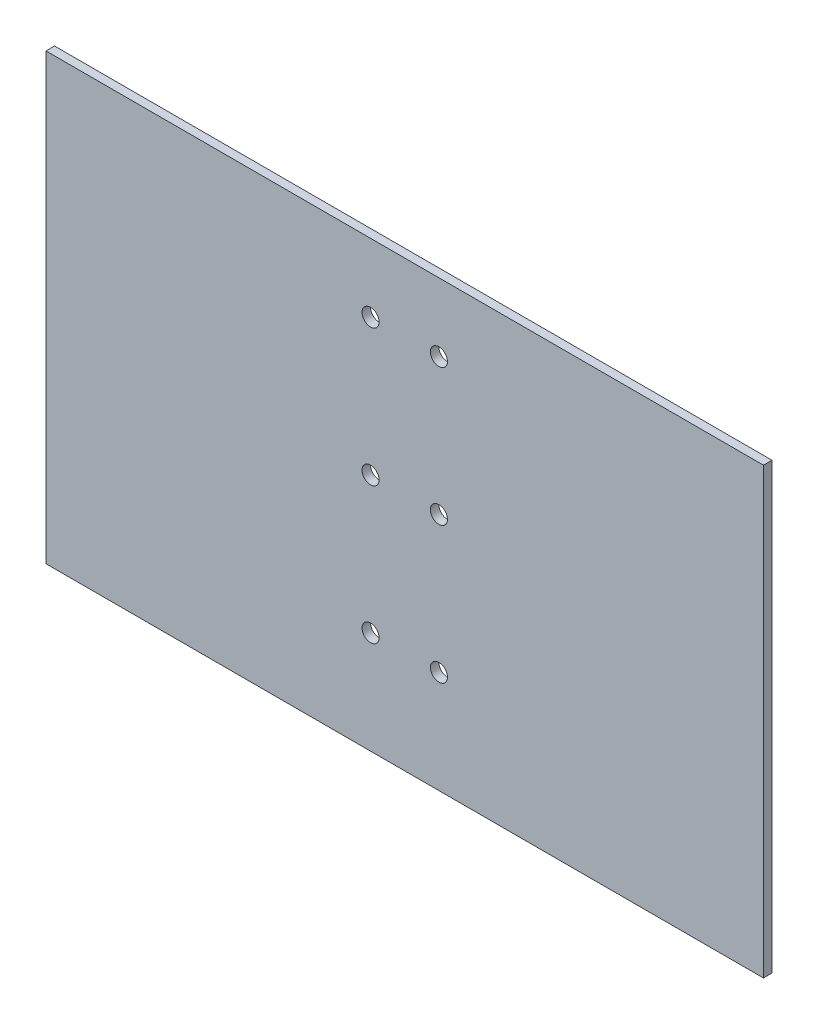
ISO-10303-21;
HEADER;
FILE_DESCRIPTION(('STEP AP214'),'2;1');
FILE_NAME('part.step','',(''),(''),'','','');
FILE_SCHEMA(('AUTOMOTIVE_DESIGN { 1 0 10303 214 1 1 1 1 }'));
ENDSEC;
DATA;
#1=APPLICATION_CONTEXT('core data for automotive mechanical design processes');
#2=APPLICATION_PROTOCOL_DEFINITION('international standard','automotive_design',2000,#1);
#3=PRODUCT_CONTEXT('',#1,'mechanical');
#4=PRODUCT('Part','Part','',(#3));
#5=PRODUCT_RELATED_PRODUCT_CATEGORY('part','',(#4));
#6=PRODUCT_DEFINITION_FORMATION('','',#4);
#7=PRODUCT_DEFINITION_CONTEXT('part definition',#1,'design');
#8=PRODUCT_DEFINITION('design','',#6,#7);
#9=PRODUCT_DEFINITION_SHAPE('','',#8);
#10=(LENGTH_UNIT() NAMED_UNIT(*) SI_UNIT(.MILLI.,.METRE.));
#11=(NAMED_UNIT(*) PLANE_ANGLE_UNIT() SI_UNIT($,.RADIAN.));
#12=(NAMED_UNIT(*) SI_UNIT($,.STERADIAN.) SOLID_ANGLE_UNIT());
#13=UNCERTAINTY_MEASURE_WITH_UNIT(LENGTH_MEASURE(1.E-05),#10,'distance_accuracy_value','');
#14=(GEOMETRIC_REPRESENTATION_CONTEXT(3) GLOBAL_UNCERTAINTY_ASSIGNED_CONTEXT((#13)) GLOBAL_UNIT_ASSIGNED_CONTEXT((#10,
#11,#12)) REPRESENTATION_CONTEXT('',''));
#15=CARTESIAN_POINT('',(0.,0.,0.));
#16=DIRECTION('',(0.,0.,1.));
#17=DIRECTION('',(1.,0.,0.));
#18=AXIS2_PLACEMENT_3D('',#15,#16,#17);
#19=CARTESIAN_POINT('',(0.,0.,6.35));
#20=DIRECTION('',(0.,0.,-1.));
#21=DIRECTION('',(-1.,0.,0.));
#22=AXIS2_PLACEMENT_3D('',#19,#20,#21);
#23=PLANE('',#22);
#24=CARTESIAN_POINT('',(-25.3999999999992,-76.2,6.35));
#25=DIRECTION('',(0.,0.,1.));
#26=DIRECTION('',(1.,0.,0.));
#27=AXIS2_PLACEMENT_3D('',#24,#25,#26);
#28=CIRCLE('',#27,6.35);
#29=CARTESIAN_POINT('',(-19.0499999999992,-76.2,6.35));
#30=VERTEX_POINT('',#29);
#31=EDGE_CURVE('E143',#30,#30,#28,.T.);
#32=ORIENTED_EDGE('',*,*,#31,.F.);
#33=EDGE_LOOP('',(#32));
#34=FACE_BOUND('',#33,.T.);
#35=CARTESIAN_POINT('',(-25.4,25.4,6.35));
#36=DIRECTION('',(0.,0.,1.));
#37=DIRECTION('',(1.,0.,0.));
#38=AXIS2_PLACEMENT_3D('',#35,#36,#37);
#39=CIRCLE('',#38,6.35);
#40=CARTESIAN_POINT('',(-19.05,25.4,6.35));
#41=VERTEX_POINT('',#40);
#42=EDGE_CURVE('E151',#41,#41,#39,.T.);
#43=ORIENTED_EDGE('',*,*,#42,.F.);
#44=EDGE_LOOP('',(#43));
#45=FACE_BOUND('',#44,.T.);
#46=CARTESIAN_POINT('',(25.4,25.4,6.35));
#47=DIRECTION('',(0.,0.,1.));
#48=DIRECTION('',(-1.,0.,0.));
#49=AXIS2_PLACEMENT_3D('',#46,#47,#48);
#50=CIRCLE('',#49,6.35000000000001);
#51=CARTESIAN_POINT('',(19.05,25.4,6.35));
#52=VERTEX_POINT('',#51);
#53=EDGE_CURVE('E159',#52,#52,#50,.T.);
#54=ORIENTED_EDGE('',*,*,#53,.F.);
#55=EDGE_LOOP('',(#54));
#56=FACE_BOUND('',#55,.T.);
#57=CARTESIAN_POINT('',(25.4,127.,6.35));
#58=DIRECTION('',(0.,0.,1.));
#59=DIRECTION('',(-1.,0.,0.));
#60=AXIS2_PLACEMENT_3D('',#57,#58,#59);
#61=CIRCLE('',#60,6.35);
#62=CARTESIAN_POINT('',(19.05,127.,6.35));
#63=VERTEX_POINT('',#62);
#64=EDGE_CURVE('E135',#63,#63,#61,.T.);
#65=ORIENTED_EDGE('',*,*,#64,.F.);
#66=EDGE_LOOP('',(#65));
#67=FACE_BOUND('',#66,.T.);
#68=CARTESIAN_POINT('',(25.3999999999993,-76.2,6.35));
#69=DIRECTION('',(0.,0.,1.));
#70=DIRECTION('',(-1.,0.,0.));
#71=AXIS2_PLACEMENT_3D('',#68,#69,#70);
#72=CIRCLE('',#71,6.35);
#73=CARTESIAN_POINT('',(19.0499999999993,-76.2,6.35));
#74=VERTEX_POINT('',#73);
#75=EDGE_CURVE('E126',#74,#74,#72,.T.);
#76=ORIENTED_EDGE('',*,*,#75,.F.);
#77=EDGE_LOOP('',(#76));
#78=FACE_BOUND('',#77,.T.);
#79=CARTESIAN_POINT('',(-25.4,127.,6.35));
#80=DIRECTION('',(0.,0.,1.));
#81=DIRECTION('',(1.,0.,0.));
#82=AXIS2_PLACEMENT_3D('',#79,#80,#81);
#83=CIRCLE('',#82,6.35);
#84=CARTESIAN_POINT('',(-19.05,127.,6.35));
#85=VERTEX_POINT('',#84);
#86=EDGE_CURVE('E43',#85,#85,#83,.T.);
#87=ORIENTED_EDGE('',*,*,#86,.F.);
#88=EDGE_LOOP('',(#87));
#89=FACE_BOUND('',#88,.T.);
#90=DIRECTION('',(0.,-1.,0.));
#91=VECTOR('',#90,1.);
#92=CARTESIAN_POINT('',(-266.7,-152.4,6.35));
#93=LINE('',#92,#91);
#94=CARTESIAN_POINT('',(-266.7,177.8,6.35));
#95=VERTEX_POINT('',#94);
#96=CARTESIAN_POINT('',(-266.7,-152.4,6.35));
#97=VERTEX_POINT('',#96);
#98=EDGE_CURVE('E112',#95,#97,#93,.T.);
#99=ORIENTED_EDGE('',*,*,#98,.T.);
#100=DIRECTION('',(1.,0.,0.));
#101=VECTOR('',#100,1.);
#102=CARTESIAN_POINT('',(-266.7,-152.4,6.35));
#103=LINE('',#102,#101);
#104=CARTESIAN_POINT('',(266.7,-152.4,6.35));
#105=VERTEX_POINT('',#104);
#106=EDGE_CURVE('E116',#97,#105,#103,.T.);
#107=ORIENTED_EDGE('',*,*,#106,.T.);
#108=DIRECTION('',(0.,1.,0.));
#109=VECTOR('',#108,1.);
#110=CARTESIAN_POINT('',(266.7,-152.4,6.35));
#111=LINE('',#110,#109);
#112=CARTESIAN_POINT('',(266.7,177.8,6.35));
#113=VERTEX_POINT('',#112);
#114=EDGE_CURVE('E93',#105,#113,#111,.T.);
#115=ORIENTED_EDGE('',*,*,#114,.T.);
#116=DIRECTION('',(-1.,0.,0.));
#117=VECTOR('',#116,1.);
#118=CARTESIAN_POINT('',(-266.7,177.8,6.35));
#119=LINE('',#118,#117);
#120=EDGE_CURVE('E107',#113,#95,#119,.T.);
#121=ORIENTED_EDGE('',*,*,#120,.T.);
#122=EDGE_LOOP('',(#99,#107,#115,#121));
#123=FACE_BOUND('',#122,.T.);
#124=ADVANCED_FACE('F39',(#34,#45,#56,#67,#78,#89,#123),#23,.F.);
#125=CARTESIAN_POINT('',(0.,0.,0.));
#126=DIRECTION('',(0.,0.,-1.));
#127=DIRECTION('',(-1.,0.,0.));
#128=AXIS2_PLACEMENT_3D('',#125,#126,#127);
#129=PLANE('',#128);
#130=CARTESIAN_POINT('',(-25.3999999999992,-76.2,0.));
#131=DIRECTION('',(0.,0.,1.));
#132=DIRECTION('',(1.,0.,0.));
#133=AXIS2_PLACEMENT_3D('',#130,#131,#132);
#134=CIRCLE('',#133,6.35);
#135=CARTESIAN_POINT('',(-19.0499999999992,-76.2,0.));
#136=VERTEX_POINT('',#135);
#137=EDGE_CURVE('E139',#136,#136,#134,.T.);
#138=ORIENTED_EDGE('',*,*,#137,.T.);
#139=EDGE_LOOP('',(#138));
#140=FACE_BOUND('',#139,.T.);
#141=CARTESIAN_POINT('',(-25.4,25.4,0.));
#142=DIRECTION('',(0.,0.,1.));
#143=DIRECTION('',(1.,0.,0.));
#144=AXIS2_PLACEMENT_3D('',#141,#142,#143);
#145=CIRCLE('',#144,6.35);
#146=CARTESIAN_POINT('',(-19.05,25.4,0.));
#147=VERTEX_POINT('',#146);
#148=EDGE_CURVE('E147',#147,#147,#145,.T.);
#149=ORIENTED_EDGE('',*,*,#148,.T.);
#150=EDGE_LOOP('',(#149));
#151=FACE_BOUND('',#150,.T.);
#152=CARTESIAN_POINT('',(25.4,25.4,0.));
#153=DIRECTION('',(0.,0.,1.));
#154=DIRECTION('',(-1.,0.,0.));
#155=AXIS2_PLACEMENT_3D('',#152,#153,#154);
#156=CIRCLE('',#155,6.35000000000001);
#157=CARTESIAN_POINT('',(19.05,25.4,0.));
#158=VERTEX_POINT('',#157);
#159=EDGE_CURVE('E155',#158,#158,#156,.T.);
#160=ORIENTED_EDGE('',*,*,#159,.T.);
#161=EDGE_LOOP('',(#160));
#162=FACE_BOUND('',#161,.T.);
#163=CARTESIAN_POINT('',(25.4,127.,0.));
#164=DIRECTION('',(0.,0.,1.));
#165=DIRECTION('',(-1.,0.,0.));
#166=AXIS2_PLACEMENT_3D('',#163,#164,#165);
#167=CIRCLE('',#166,6.35);
#168=CARTESIAN_POINT('',(19.05,127.,0.));
#169=VERTEX_POINT('',#168);
#170=EDGE_CURVE('E163',#169,#169,#167,.T.);
#171=ORIENTED_EDGE('',*,*,#170,.T.);
#172=EDGE_LOOP('',(#171));
#173=FACE_BOUND('',#172,.T.);
#174=CARTESIAN_POINT('',(25.3999999999993,-76.2,0.));
#175=DIRECTION('',(0.,0.,1.));
#176=DIRECTION('',(-1.,0.,0.));
#177=AXIS2_PLACEMENT_3D('',#174,#175,#176);
#178=CIRCLE('',#177,6.35);
#179=CARTESIAN_POINT('',(19.0499999999993,-76.2,0.));
#180=VERTEX_POINT('',#179);
#181=EDGE_CURVE('E131',#180,#180,#178,.T.);
#182=ORIENTED_EDGE('',*,*,#181,.T.);
#183=EDGE_LOOP('',(#182));
#184=FACE_BOUND('',#183,.T.);
#185=CARTESIAN_POINT('',(-25.4,127.,0.));
#186=DIRECTION('',(0.,0.,1.));
#187=DIRECTION('',(1.,0.,0.));
#188=AXIS2_PLACEMENT_3D('',#185,#186,#187);
#189=CIRCLE('',#188,6.35);
#190=CARTESIAN_POINT('',(-19.05,127.,0.));
#191=VERTEX_POINT('',#190);
#192=EDGE_CURVE('E11',#191,#191,#189,.T.);
#193=ORIENTED_EDGE('',*,*,#192,.T.);
#194=EDGE_LOOP('',(#193));
#195=FACE_BOUND('',#194,.T.);
#196=DIRECTION('',(0.,-1.,0.));
#197=VECTOR('',#196,1.);
#198=CARTESIAN_POINT('',(-266.7,-152.4,0.));
#199=LINE('',#198,#197);
#200=CARTESIAN_POINT('',(-266.7,177.8,0.));
#201=VERTEX_POINT('',#200);
#202=CARTESIAN_POINT('',(-266.7,-152.4,0.));
#203=VERTEX_POINT('',#202);
#204=EDGE_CURVE('E104',#201,#203,#199,.T.);
#205=ORIENTED_EDGE('',*,*,#204,.F.);
#206=DIRECTION('',(-1.,0.,0.));
#207=VECTOR('',#206,1.);
#208=CARTESIAN_POINT('',(-266.7,177.8,0.));
#209=LINE('',#208,#207);
#210=CARTESIAN_POINT('',(266.7,177.8,0.));
#211=VERTEX_POINT('',#210);
#212=EDGE_CURVE('E99',#211,#201,#209,.T.);
#213=ORIENTED_EDGE('',*,*,#212,.F.);
#214=DIRECTION('',(0.,1.,0.));
#215=VECTOR('',#214,1.);
#216=CARTESIAN_POINT('',(266.7,-152.4,0.));
#217=LINE('',#216,#215);
#218=CARTESIAN_POINT('',(266.7,-152.4,0.));
#219=VERTEX_POINT('',#218);
#220=EDGE_CURVE('E91',#219,#211,#217,.T.);
#221=ORIENTED_EDGE('',*,*,#220,.F.);
#222=DIRECTION('',(1.,0.,0.));
#223=VECTOR('',#222,1.);
#224=CARTESIAN_POINT('',(-266.7,-152.4,0.));
#225=LINE('',#224,#223);
#226=EDGE_CURVE('E98',#203,#219,#225,.T.);
#227=ORIENTED_EDGE('',*,*,#226,.F.);
#228=EDGE_LOOP('',(#205,#213,#221,#227));
#229=FACE_BOUND('',#228,.T.);
#230=ADVANCED_FACE('F41',(#140,#151,#162,#173,#184,#195,#229),#129,.T.);
#231=CARTESIAN_POINT('',(-25.4,127.,0.));
#232=DIRECTION('',(0.,0.,1.));
#233=DIRECTION('',(1.,0.,0.));
#234=AXIS2_PLACEMENT_3D('',#231,#232,#233);
#235=CYLINDRICAL_SURFACE('',#234,6.35);
#236=ORIENTED_EDGE('',*,*,#192,.F.);
#237=EDGE_LOOP('',(#236));
#238=FACE_BOUND('',#237,.T.);
#239=ORIENTED_EDGE('',*,*,#86,.T.);
#240=EDGE_LOOP('',(#239));
#241=FACE_BOUND('',#240,.T.);
#242=ADVANCED_FACE('F198',(#238,#241),#235,.F.);
#243=CARTESIAN_POINT('',(25.3999999999993,-76.2,0.));
#244=DIRECTION('',(0.,0.,1.));
#245=DIRECTION('',(1.,0.,0.));
#246=AXIS2_PLACEMENT_3D('',#243,#244,#245);
#247=CYLINDRICAL_SURFACE('',#246,6.35);
#248=ORIENTED_EDGE('',*,*,#181,.F.);
#249=EDGE_LOOP('',(#248));
#250=FACE_BOUND('',#249,.T.);
#251=ORIENTED_EDGE('',*,*,#75,.T.);
#252=EDGE_LOOP('',(#251));
#253=FACE_BOUND('',#252,.T.);
#254=ADVANCED_FACE('F195',(#250,#253),#247,.F.);
#255=CARTESIAN_POINT('',(25.4,127.,0.));
#256=DIRECTION('',(0.,0.,1.));
#257=DIRECTION('',(1.,0.,0.));
#258=AXIS2_PLACEMENT_3D('',#255,#256,#257);
#259=CYLINDRICAL_SURFACE('',#258,6.35);
#260=ORIENTED_EDGE('',*,*,#170,.F.);
#261=EDGE_LOOP('',(#260));
#262=FACE_BOUND('',#261,.T.);
#263=ORIENTED_EDGE('',*,*,#64,.T.);
#264=EDGE_LOOP('',(#263));
#265=FACE_BOUND('',#264,.T.);
#266=ADVANCED_FACE('F171',(#262,#265),#259,.F.);
#267=CARTESIAN_POINT('',(25.4,25.4,0.));
#268=DIRECTION('',(0.,0.,1.));
#269=DIRECTION('',(1.,0.,0.));
#270=AXIS2_PLACEMENT_3D('',#267,#268,#269);
#271=CYLINDRICAL_SURFACE('',#270,6.35000000000001);
#272=ORIENTED_EDGE('',*,*,#159,.F.);
#273=EDGE_LOOP('',(#272));
#274=FACE_BOUND('',#273,.T.);
#275=ORIENTED_EDGE('',*,*,#53,.T.);
#276=EDGE_LOOP('',(#275));
#277=FACE_BOUND('',#276,.T.);
#278=ADVANCED_FACE('F206',(#274,#277),#271,.F.);
#279=CARTESIAN_POINT('',(-25.4,25.4,0.));
#280=DIRECTION('',(0.,0.,1.));
#281=DIRECTION('',(1.,0.,0.));
#282=AXIS2_PLACEMENT_3D('',#279,#280,#281);
#283=CYLINDRICAL_SURFACE('',#282,6.35);
#284=ORIENTED_EDGE('',*,*,#148,.F.);
#285=EDGE_LOOP('',(#284));
#286=FACE_BOUND('',#285,.T.);
#287=ORIENTED_EDGE('',*,*,#42,.T.);
#288=EDGE_LOOP('',(#287));
#289=FACE_BOUND('',#288,.T.);
#290=ADVANCED_FACE('F202',(#286,#289),#283,.F.);
#291=CARTESIAN_POINT('',(-25.3999999999992,-76.2,0.));
#292=DIRECTION('',(0.,0.,1.));
#293=DIRECTION('',(1.,0.,0.));
#294=AXIS2_PLACEMENT_3D('',#291,#292,#293);
#295=CYLINDRICAL_SURFACE('',#294,6.35);
#296=ORIENTED_EDGE('',*,*,#137,.F.);
#297=EDGE_LOOP('',(#296));
#298=FACE_BOUND('',#297,.T.);
#299=ORIENTED_EDGE('',*,*,#31,.T.);
#300=EDGE_LOOP('',(#299));
#301=FACE_BOUND('',#300,.T.);
#302=ADVANCED_FACE('F190',(#298,#301),#295,.F.);
#303=CARTESIAN_POINT('',(-266.7,-152.4,0.));
#304=DIRECTION('',(-1.,0.,0.));
#305=DIRECTION('',(0.,0.,1.));
#306=AXIS2_PLACEMENT_3D('',#303,#304,#305);
#307=PLANE('',#306);
#308=ORIENTED_EDGE('',*,*,#98,.F.);
#309=DIRECTION('',(0.,0.,1.));
#310=VECTOR('',#309,1.);
#311=CARTESIAN_POINT('',(-266.7,177.8,0.));
#312=LINE('',#311,#310);
#313=EDGE_CURVE('E57',#201,#95,#312,.T.);
#314=ORIENTED_EDGE('',*,*,#313,.F.);
#315=ORIENTED_EDGE('',*,*,#204,.T.);
#316=DIRECTION('',(0.,0.,1.));
#317=VECTOR('',#316,1.);
#318=CARTESIAN_POINT('',(-266.7,-152.4,0.));
#319=LINE('',#318,#317);
#320=EDGE_CURVE('E85',#203,#97,#319,.T.);
#321=ORIENTED_EDGE('',*,*,#320,.T.);
#322=EDGE_LOOP('',(#308,#314,#315,#321));
#323=FACE_BOUND('',#322,.T.);
#324=ADVANCED_FACE('F181',(#323),#307,.T.);
#325=CARTESIAN_POINT('',(-266.7,177.8,0.));
#326=DIRECTION('',(0.,1.,0.));
#327=DIRECTION('',(0.,0.,1.));
#328=AXIS2_PLACEMENT_3D('',#325,#326,#327);
#329=PLANE('',#328);
#330=ORIENTED_EDGE('',*,*,#120,.F.);
#331=DIRECTION('',(0.,0.,1.));
#332=VECTOR('',#331,1.);
#333=CARTESIAN_POINT('',(266.7,177.8,0.));
#334=LINE('',#333,#332);
#335=EDGE_CURVE('E74',#211,#113,#334,.T.);
#336=ORIENTED_EDGE('',*,*,#335,.F.);
#337=ORIENTED_EDGE('',*,*,#212,.T.);
#338=ORIENTED_EDGE('',*,*,#313,.T.);
#339=EDGE_LOOP('',(#330,#336,#337,#338));
#340=FACE_BOUND('',#339,.T.);
#341=ADVANCED_FACE('F182',(#340),#329,.T.);
#342=CARTESIAN_POINT('',(266.7,-152.4,0.));
#343=DIRECTION('',(1.,0.,0.));
#344=DIRECTION('',(0.,0.,-1.));
#345=AXIS2_PLACEMENT_3D('',#342,#343,#344);
#346=PLANE('',#345);
#347=ORIENTED_EDGE('',*,*,#114,.F.);
#348=DIRECTION('',(0.,0.,1.));
#349=VECTOR('',#348,1.);
#350=CARTESIAN_POINT('',(266.7,-152.4,0.));
#351=LINE('',#350,#349);
#352=EDGE_CURVE('E88',#219,#105,#351,.T.);
#353=ORIENTED_EDGE('',*,*,#352,.F.);
#354=ORIENTED_EDGE('',*,*,#220,.T.);
#355=ORIENTED_EDGE('',*,*,#335,.T.);
#356=EDGE_LOOP('',(#347,#353,#354,#355));
#357=FACE_BOUND('',#356,.T.);
#358=ADVANCED_FACE('F90',(#357),#346,.T.);
#359=CARTESIAN_POINT('',(-266.7,-152.4,0.));
#360=DIRECTION('',(0.,-1.,0.));
#361=DIRECTION('',(0.,0.,-1.));
#362=AXIS2_PLACEMENT_3D('',#359,#360,#361);
#363=PLANE('',#362);
#364=ORIENTED_EDGE('',*,*,#106,.F.);
#365=ORIENTED_EDGE('',*,*,#320,.F.);
#366=ORIENTED_EDGE('',*,*,#226,.T.);
#367=ORIENTED_EDGE('',*,*,#352,.T.);
#368=EDGE_LOOP('',(#364,#365,#366,#367));
#369=FACE_BOUND('',#368,.T.);
#370=ADVANCED_FACE('F102',(#369),#363,.T.);
#371=CLOSED_SHELL('',(#124,#230,#242,#254,#266,#278,#290,#302,#324,#341,#358,#370));
#372=MANIFOLD_SOLID_BREP('B2',#371);
#373=ADVANCED_BREP_SHAPE_REPRESENTATION('',(#18,#372),#14);
#374=SHAPE_DEFINITION_REPRESENTATION(#9,#373);
ENDSEC;
END-ISO-10303-21;
